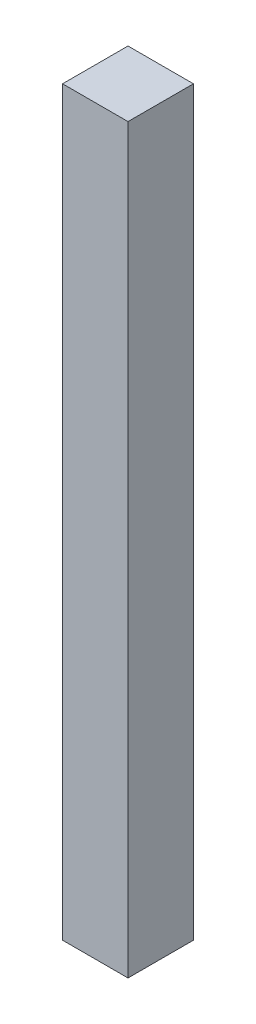
ISO-10303-21;
HEADER;
FILE_DESCRIPTION(('STEP AP214'),'2;1');
FILE_NAME('part.step','',(''),(''),'','','');
FILE_SCHEMA(('AUTOMOTIVE_DESIGN { 1 0 10303 214 1 1 1 1 }'));
ENDSEC;
DATA;
#1=APPLICATION_CONTEXT('core data for automotive mechanical design processes');
#2=APPLICATION_PROTOCOL_DEFINITION('international standard','automotive_design',2000,#1);
#3=PRODUCT_CONTEXT('',#1,'mechanical');
#4=PRODUCT('Part','Part','',(#3));
#5=PRODUCT_RELATED_PRODUCT_CATEGORY('part','',(#4));
#6=PRODUCT_DEFINITION_FORMATION('','',#4);
#7=PRODUCT_DEFINITION_CONTEXT('part definition',#1,'design');
#8=PRODUCT_DEFINITION('design','',#6,#7);
#9=PRODUCT_DEFINITION_SHAPE('','',#8);
#10=(LENGTH_UNIT() NAMED_UNIT(*) SI_UNIT(.MILLI.,.METRE.));
#11=(NAMED_UNIT(*) PLANE_ANGLE_UNIT() SI_UNIT($,.RADIAN.));
#12=(NAMED_UNIT(*) SI_UNIT($,.STERADIAN.) SOLID_ANGLE_UNIT());
#13=UNCERTAINTY_MEASURE_WITH_UNIT(LENGTH_MEASURE(1.E-05),#10,'distance_accuracy_value','');
#14=(GEOMETRIC_REPRESENTATION_CONTEXT(3) GLOBAL_UNCERTAINTY_ASSIGNED_CONTEXT((#13)) GLOBAL_UNIT_ASSIGNED_CONTEXT((#10,
#11,#12)) REPRESENTATION_CONTEXT('',''));
#15=CARTESIAN_POINT('',(0.,0.,0.));
#16=DIRECTION('',(0.,0.,1.));
#17=DIRECTION('',(1.,0.,0.));
#18=AXIS2_PLACEMENT_3D('',#15,#16,#17);
#19=CARTESIAN_POINT('',(15.,340.,15.));
#20=DIRECTION('',(-1.,0.,0.));
#21=DIRECTION('',(0.,0.,1.));
#22=AXIS2_PLACEMENT_3D('',#19,#20,#21);
#23=PLANE('',#22);
#24=DIRECTION('',(0.,0.,-1.));
#25=VECTOR('',#24,1.);
#26=CARTESIAN_POINT('',(15.,0.,15.));
#27=LINE('',#26,#25);
#28=CARTESIAN_POINT('',(15.,0.,15.));
#29=VERTEX_POINT('',#28);
#30=CARTESIAN_POINT('',(15.,0.,-15.));
#31=VERTEX_POINT('',#30);
#32=EDGE_CURVE('E102',#29,#31,#27,.T.);
#33=ORIENTED_EDGE('',*,*,#32,.T.);
#34=DIRECTION('',(0.,-1.,0.));
#35=VECTOR('',#34,1.);
#36=CARTESIAN_POINT('',(15.,340.,-15.));
#37=LINE('',#36,#35);
#38=CARTESIAN_POINT('',(15.,340.,-15.));
#39=VERTEX_POINT('',#38);
#40=EDGE_CURVE('E11',#39,#31,#37,.T.);
#41=ORIENTED_EDGE('',*,*,#40,.F.);
#42=DIRECTION('',(0.,0.,-1.));
#43=VECTOR('',#42,1.);
#44=CARTESIAN_POINT('',(15.,340.,15.));
#45=LINE('',#44,#43);
#46=CARTESIAN_POINT('',(15.,340.,15.));
#47=VERTEX_POINT('',#46);
#48=EDGE_CURVE('E90',#47,#39,#45,.T.);
#49=ORIENTED_EDGE('',*,*,#48,.F.);
#50=DIRECTION('',(0.,-1.,0.));
#51=VECTOR('',#50,1.);
#52=CARTESIAN_POINT('',(15.,340.,15.));
#53=LINE('',#52,#51);
#54=EDGE_CURVE('E98',#47,#29,#53,.T.);
#55=ORIENTED_EDGE('',*,*,#54,.T.);
#56=EDGE_LOOP('',(#33,#41,#49,#55));
#57=FACE_BOUND('',#56,.T.);
#58=ADVANCED_FACE('F39',(#57),#23,.F.);
#59=CARTESIAN_POINT('',(-15.,340.,-15.));
#60=DIRECTION('',(0.,0.,1.));
#61=DIRECTION('',(1.,0.,0.));
#62=AXIS2_PLACEMENT_3D('',#59,#60,#61);
#63=PLANE('',#62);
#64=DIRECTION('',(-1.,0.,0.));
#65=VECTOR('',#64,1.);
#66=CARTESIAN_POINT('',(-15.,0.,-15.));
#67=LINE('',#66,#65);
#68=CARTESIAN_POINT('',(-15.,0.,-15.));
#69=VERTEX_POINT('',#68);
#70=EDGE_CURVE('E94',#31,#69,#67,.T.);
#71=ORIENTED_EDGE('',*,*,#70,.T.);
#72=DIRECTION('',(0.,-1.,0.));
#73=VECTOR('',#72,1.);
#74=CARTESIAN_POINT('',(-15.,340.,-15.));
#75=LINE('',#74,#73);
#76=CARTESIAN_POINT('',(-15.,340.,-15.));
#77=VERTEX_POINT('',#76);
#78=EDGE_CURVE('E47',#77,#69,#75,.T.);
#79=ORIENTED_EDGE('',*,*,#78,.F.);
#80=DIRECTION('',(-1.,0.,0.));
#81=VECTOR('',#80,1.);
#82=CARTESIAN_POINT('',(-15.,340.,-15.));
#83=LINE('',#82,#81);
#84=EDGE_CURVE('E85',#39,#77,#83,.T.);
#85=ORIENTED_EDGE('',*,*,#84,.F.);
#86=ORIENTED_EDGE('',*,*,#40,.T.);
#87=EDGE_LOOP('',(#71,#79,#85,#86));
#88=FACE_BOUND('',#87,.T.);
#89=ADVANCED_FACE('F93',(#88),#63,.F.);
#90=CARTESIAN_POINT('',(-15.,340.,15.));
#91=DIRECTION('',(1.,0.,0.));
#92=DIRECTION('',(0.,0.,-1.));
#93=AXIS2_PLACEMENT_3D('',#90,#91,#92);
#94=PLANE('',#93);
#95=DIRECTION('',(0.,0.,1.));
#96=VECTOR('',#95,1.);
#97=CARTESIAN_POINT('',(-15.,0.,15.));
#98=LINE('',#97,#96);
#99=CARTESIAN_POINT('',(-15.,0.,15.));
#100=VERTEX_POINT('',#99);
#101=EDGE_CURVE('E72',#69,#100,#98,.T.);
#102=ORIENTED_EDGE('',*,*,#101,.T.);
#103=DIRECTION('',(0.,-1.,0.));
#104=VECTOR('',#103,1.);
#105=CARTESIAN_POINT('',(-15.,340.,15.));
#106=LINE('',#105,#104);
#107=CARTESIAN_POINT('',(-15.,340.,15.));
#108=VERTEX_POINT('',#107);
#109=EDGE_CURVE('E95',#108,#100,#106,.T.);
#110=ORIENTED_EDGE('',*,*,#109,.F.);
#111=DIRECTION('',(0.,0.,1.));
#112=VECTOR('',#111,1.);
#113=CARTESIAN_POINT('',(-15.,340.,15.));
#114=LINE('',#113,#112);
#115=EDGE_CURVE('E88',#77,#108,#114,.T.);
#116=ORIENTED_EDGE('',*,*,#115,.F.);
#117=ORIENTED_EDGE('',*,*,#78,.T.);
#118=EDGE_LOOP('',(#102,#110,#116,#117));
#119=FACE_BOUND('',#118,.T.);
#120=ADVANCED_FACE('F96',(#119),#94,.F.);
#121=CARTESIAN_POINT('',(-15.,340.,15.));
#122=DIRECTION('',(0.,0.,-1.));
#123=DIRECTION('',(-1.,0.,0.));
#124=AXIS2_PLACEMENT_3D('',#121,#122,#123);
#125=PLANE('',#124);
#126=DIRECTION('',(1.,0.,0.));
#127=VECTOR('',#126,1.);
#128=CARTESIAN_POINT('',(-15.,0.,15.));
#129=LINE('',#128,#127);
#130=EDGE_CURVE('E78',#100,#29,#129,.T.);
#131=ORIENTED_EDGE('',*,*,#130,.T.);
#132=ORIENTED_EDGE('',*,*,#54,.F.);
#133=DIRECTION('',(1.,0.,0.));
#134=VECTOR('',#133,1.);
#135=CARTESIAN_POINT('',(-15.,340.,15.));
#136=LINE('',#135,#134);
#137=EDGE_CURVE('E55',#108,#47,#136,.T.);
#138=ORIENTED_EDGE('',*,*,#137,.F.);
#139=ORIENTED_EDGE('',*,*,#109,.T.);
#140=EDGE_LOOP('',(#131,#132,#138,#139));
#141=FACE_BOUND('',#140,.T.);
#142=ADVANCED_FACE('F109',(#141),#125,.F.);
#143=CARTESIAN_POINT('',(0.,340.,0.));
#144=DIRECTION('',(0.,-1.,0.));
#145=DIRECTION('',(0.,0.,-1.));
#146=AXIS2_PLACEMENT_3D('',#143,#144,#145);
#147=PLANE('',#146);
#148=ORIENTED_EDGE('',*,*,#48,.T.);
#149=ORIENTED_EDGE('',*,*,#84,.T.);
#150=ORIENTED_EDGE('',*,*,#115,.T.);
#151=ORIENTED_EDGE('',*,*,#137,.T.);
#152=EDGE_LOOP('',(#148,#149,#150,#151));
#153=FACE_BOUND('',#152,.T.);
#154=ADVANCED_FACE('F86',(#153),#147,.F.);
#155=CARTESIAN_POINT('',(0.,0.,0.));
#156=DIRECTION('',(0.,-1.,0.));
#157=DIRECTION('',(0.,0.,-1.));
#158=AXIS2_PLACEMENT_3D('',#155,#156,#157);
#159=PLANE('',#158);
#160=ORIENTED_EDGE('',*,*,#32,.F.);
#161=ORIENTED_EDGE('',*,*,#130,.F.);
#162=ORIENTED_EDGE('',*,*,#101,.F.);
#163=ORIENTED_EDGE('',*,*,#70,.F.);
#164=EDGE_LOOP('',(#160,#161,#162,#163));
#165=FACE_BOUND('',#164,.T.);
#166=ADVANCED_FACE('F112',(#165),#159,.T.);
#167=CLOSED_SHELL('',(#58,#89,#120,#142,#154,#166));
#168=MANIFOLD_SOLID_BREP('B2',#167);
#169=ADVANCED_BREP_SHAPE_REPRESENTATION('',(#18,#168),#14);
#170=SHAPE_DEFINITION_REPRESENTATION(#9,#169);
ENDSEC;
END-ISO-10303-21;
